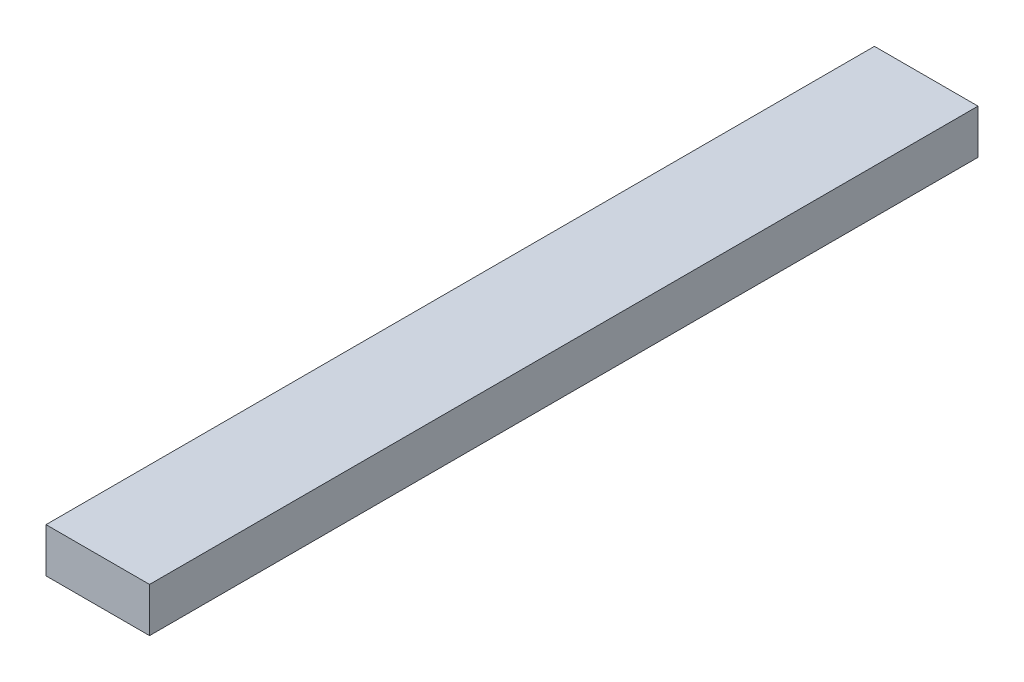
ISO-10303-21;
HEADER;
FILE_DESCRIPTION(('STEP AP214'),'2;1');
FILE_NAME('part.step','',(''),(''),'','','');
FILE_SCHEMA(('AUTOMOTIVE_DESIGN { 1 0 10303 214 1 1 1 1 }'));
ENDSEC;
DATA;
#1=APPLICATION_CONTEXT('core data for automotive mechanical design processes');
#2=APPLICATION_PROTOCOL_DEFINITION('international standard','automotive_design',2000,#1);
#3=PRODUCT_CONTEXT('',#1,'mechanical');
#4=PRODUCT('Part','Part','',(#3));
#5=PRODUCT_RELATED_PRODUCT_CATEGORY('part','',(#4));
#6=PRODUCT_DEFINITION_FORMATION('','',#4);
#7=PRODUCT_DEFINITION_CONTEXT('part definition',#1,'design');
#8=PRODUCT_DEFINITION('design','',#6,#7);
#9=PRODUCT_DEFINITION_SHAPE('','',#8);
#10=(LENGTH_UNIT() NAMED_UNIT(*) SI_UNIT(.MILLI.,.METRE.));
#11=(NAMED_UNIT(*) PLANE_ANGLE_UNIT() SI_UNIT($,.RADIAN.));
#12=(NAMED_UNIT(*) SI_UNIT($,.STERADIAN.) SOLID_ANGLE_UNIT());
#13=UNCERTAINTY_MEASURE_WITH_UNIT(LENGTH_MEASURE(1.E-05),#10,'distance_accuracy_value','');
#14=(GEOMETRIC_REPRESENTATION_CONTEXT(3) GLOBAL_UNCERTAINTY_ASSIGNED_CONTEXT((#13)) GLOBAL_UNIT_ASSIGNED_CONTEXT((#10,
#11,#12)) REPRESENTATION_CONTEXT('',''));
#15=CARTESIAN_POINT('',(0.,0.,0.));
#16=DIRECTION('',(0.,0.,1.));
#17=DIRECTION('',(1.,0.,0.));
#18=AXIS2_PLACEMENT_3D('',#15,#16,#17);
#19=CARTESIAN_POINT('',(0.,0.,711.2));
#20=DIRECTION('',(1.,0.,0.));
#21=DIRECTION('',(0.,0.,-1.));
#22=AXIS2_PLACEMENT_3D('',#19,#20,#21);
#23=PLANE('',#22);
#24=DIRECTION('',(0.,-1.,0.));
#25=VECTOR('',#24,1.);
#26=CARTESIAN_POINT('',(0.,0.,0.));
#27=LINE('',#26,#25);
#28=CARTESIAN_POINT('',(0.,38.1,0.));
#29=VERTEX_POINT('',#28);
#30=CARTESIAN_POINT('',(0.,0.,0.));
#31=VERTEX_POINT('',#30);
#32=EDGE_CURVE('E97',#29,#31,#27,.T.);
#33=ORIENTED_EDGE('',*,*,#32,.T.);
#34=DIRECTION('',(0.,0.,-1.));
#35=VECTOR('',#34,1.);
#36=CARTESIAN_POINT('',(0.,0.,711.2));
#37=LINE('',#36,#35);
#38=CARTESIAN_POINT('',(0.,0.,711.2));
#39=VERTEX_POINT('',#38);
#40=EDGE_CURVE('E11',#39,#31,#37,.T.);
#41=ORIENTED_EDGE('',*,*,#40,.F.);
#42=DIRECTION('',(0.,-1.,0.));
#43=VECTOR('',#42,1.);
#44=CARTESIAN_POINT('',(0.,0.,711.2));
#45=LINE('',#44,#43);
#46=CARTESIAN_POINT('',(0.,38.1,711.2));
#47=VERTEX_POINT('',#46);
#48=EDGE_CURVE('E85',#47,#39,#45,.T.);
#49=ORIENTED_EDGE('',*,*,#48,.F.);
#50=DIRECTION('',(0.,0.,-1.));
#51=VECTOR('',#50,1.);
#52=CARTESIAN_POINT('',(0.,38.1,711.2));
#53=LINE('',#52,#51);
#54=EDGE_CURVE('E93',#47,#29,#53,.T.);
#55=ORIENTED_EDGE('',*,*,#54,.T.);
#56=EDGE_LOOP('',(#33,#41,#49,#55));
#57=FACE_BOUND('',#56,.T.);
#58=ADVANCED_FACE('F34',(#57),#23,.F.);
#59=CARTESIAN_POINT('',(0.,0.,711.2));
#60=DIRECTION('',(0.,1.,0.));
#61=DIRECTION('',(0.,0.,1.));
#62=AXIS2_PLACEMENT_3D('',#59,#60,#61);
#63=PLANE('',#62);
#64=DIRECTION('',(1.,0.,0.));
#65=VECTOR('',#64,1.);
#66=CARTESIAN_POINT('',(0.,0.,0.));
#67=LINE('',#66,#65);
#68=CARTESIAN_POINT('',(88.9,0.,0.));
#69=VERTEX_POINT('',#68);
#70=EDGE_CURVE('E89',#31,#69,#67,.T.);
#71=ORIENTED_EDGE('',*,*,#70,.T.);
#72=DIRECTION('',(0.,0.,-1.));
#73=VECTOR('',#72,1.);
#74=CARTESIAN_POINT('',(88.9,0.,711.2));
#75=LINE('',#74,#73);
#76=CARTESIAN_POINT('',(88.9,0.,711.2));
#77=VERTEX_POINT('',#76);
#78=EDGE_CURVE('E42',#77,#69,#75,.T.);
#79=ORIENTED_EDGE('',*,*,#78,.F.);
#80=DIRECTION('',(1.,0.,0.));
#81=VECTOR('',#80,1.);
#82=CARTESIAN_POINT('',(0.,0.,711.2));
#83=LINE('',#82,#81);
#84=EDGE_CURVE('E80',#39,#77,#83,.T.);
#85=ORIENTED_EDGE('',*,*,#84,.F.);
#86=ORIENTED_EDGE('',*,*,#40,.T.);
#87=EDGE_LOOP('',(#71,#79,#85,#86));
#88=FACE_BOUND('',#87,.T.);
#89=ADVANCED_FACE('F88',(#88),#63,.F.);
#90=CARTESIAN_POINT('',(88.9,0.,711.2));
#91=DIRECTION('',(-1.,0.,0.));
#92=DIRECTION('',(0.,0.,1.));
#93=AXIS2_PLACEMENT_3D('',#90,#91,#92);
#94=PLANE('',#93);
#95=DIRECTION('',(0.,1.,0.));
#96=VECTOR('',#95,1.);
#97=CARTESIAN_POINT('',(88.9,0.,0.));
#98=LINE('',#97,#96);
#99=CARTESIAN_POINT('',(88.9,38.1,0.));
#100=VERTEX_POINT('',#99);
#101=EDGE_CURVE('E67',#69,#100,#98,.T.);
#102=ORIENTED_EDGE('',*,*,#101,.T.);
#103=DIRECTION('',(0.,0.,-1.));
#104=VECTOR('',#103,1.);
#105=CARTESIAN_POINT('',(88.9,38.1,711.2));
#106=LINE('',#105,#104);
#107=CARTESIAN_POINT('',(88.9,38.1,711.2));
#108=VERTEX_POINT('',#107);
#109=EDGE_CURVE('E90',#108,#100,#106,.T.);
#110=ORIENTED_EDGE('',*,*,#109,.F.);
#111=DIRECTION('',(0.,1.,0.));
#112=VECTOR('',#111,1.);
#113=CARTESIAN_POINT('',(88.9,0.,711.2));
#114=LINE('',#113,#112);
#115=EDGE_CURVE('E83',#77,#108,#114,.T.);
#116=ORIENTED_EDGE('',*,*,#115,.F.);
#117=ORIENTED_EDGE('',*,*,#78,.T.);
#118=EDGE_LOOP('',(#102,#110,#116,#117));
#119=FACE_BOUND('',#118,.T.);
#120=ADVANCED_FACE('F91',(#119),#94,.F.);
#121=CARTESIAN_POINT('',(0.,38.1,711.2));
#122=DIRECTION('',(0.,-1.,0.));
#123=DIRECTION('',(0.,0.,-1.));
#124=AXIS2_PLACEMENT_3D('',#121,#122,#123);
#125=PLANE('',#124);
#126=DIRECTION('',(-1.,0.,0.));
#127=VECTOR('',#126,1.);
#128=CARTESIAN_POINT('',(0.,38.1,0.));
#129=LINE('',#128,#127);
#130=EDGE_CURVE('E73',#100,#29,#129,.T.);
#131=ORIENTED_EDGE('',*,*,#130,.T.);
#132=ORIENTED_EDGE('',*,*,#54,.F.);
#133=DIRECTION('',(-1.,0.,0.));
#134=VECTOR('',#133,1.);
#135=CARTESIAN_POINT('',(0.,38.1,711.2));
#136=LINE('',#135,#134);
#137=EDGE_CURVE('E50',#108,#47,#136,.T.);
#138=ORIENTED_EDGE('',*,*,#137,.F.);
#139=ORIENTED_EDGE('',*,*,#109,.T.);
#140=EDGE_LOOP('',(#131,#132,#138,#139));
#141=FACE_BOUND('',#140,.T.);
#142=ADVANCED_FACE('F104',(#141),#125,.F.);
#143=CARTESIAN_POINT('',(0.,0.,711.2));
#144=DIRECTION('',(0.,0.,-1.));
#145=DIRECTION('',(-1.,0.,0.));
#146=AXIS2_PLACEMENT_3D('',#143,#144,#145);
#147=PLANE('',#146);
#148=ORIENTED_EDGE('',*,*,#48,.T.);
#149=ORIENTED_EDGE('',*,*,#84,.T.);
#150=ORIENTED_EDGE('',*,*,#115,.T.);
#151=ORIENTED_EDGE('',*,*,#137,.T.);
#152=EDGE_LOOP('',(#148,#149,#150,#151));
#153=FACE_BOUND('',#152,.T.);
#154=ADVANCED_FACE('F81',(#153),#147,.F.);
#155=CARTESIAN_POINT('',(0.,0.,0.));
#156=DIRECTION('',(0.,0.,-1.));
#157=DIRECTION('',(-1.,0.,0.));
#158=AXIS2_PLACEMENT_3D('',#155,#156,#157);
#159=PLANE('',#158);
#160=ORIENTED_EDGE('',*,*,#32,.F.);
#161=ORIENTED_EDGE('',*,*,#130,.F.);
#162=ORIENTED_EDGE('',*,*,#101,.F.);
#163=ORIENTED_EDGE('',*,*,#70,.F.);
#164=EDGE_LOOP('',(#160,#161,#162,#163));
#165=FACE_BOUND('',#164,.T.);
#166=ADVANCED_FACE('F107',(#165),#159,.T.);
#167=CLOSED_SHELL('',(#58,#89,#120,#142,#154,#166));
#168=MANIFOLD_SOLID_BREP('B2',#167);
#169=ADVANCED_BREP_SHAPE_REPRESENTATION('',(#18,#168),#14);
#170=SHAPE_DEFINITION_REPRESENTATION(#9,#169);
ENDSEC;
END-ISO-10303-21;
